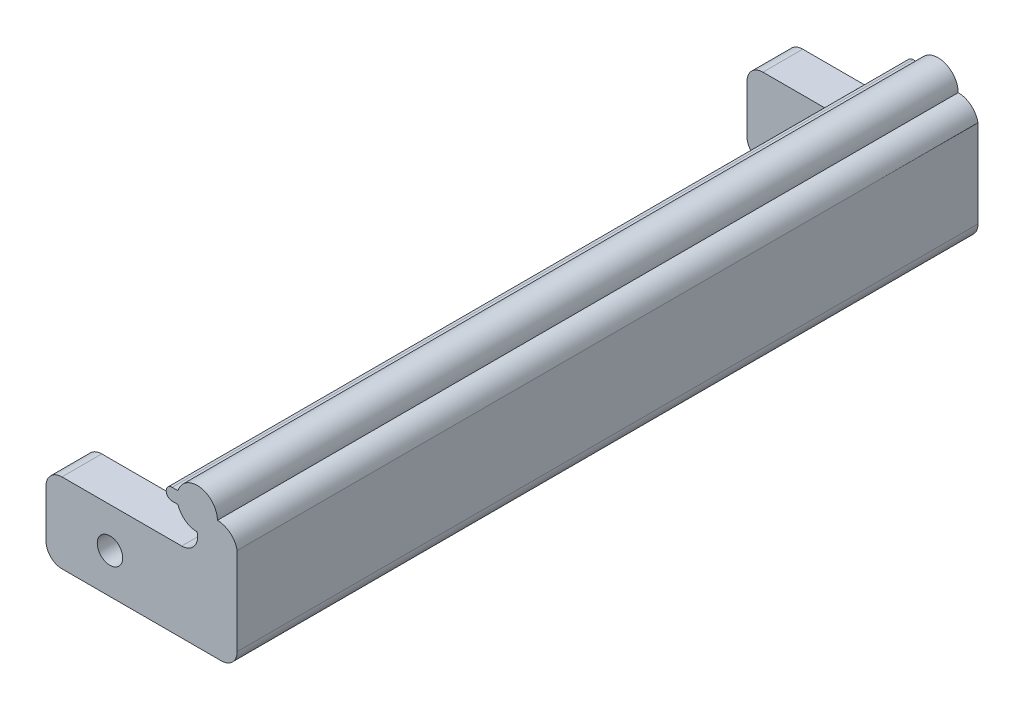
ISO-10303-21;
HEADER;
FILE_DESCRIPTION(('STEP AP214'),'2;1');
FILE_NAME('part.step','',(''),(''),'','','');
FILE_SCHEMA(('AUTOMOTIVE_DESIGN { 1 0 10303 214 1 1 1 1 }'));
ENDSEC;
DATA;
#1=APPLICATION_CONTEXT('core data for automotive mechanical design processes');
#2=APPLICATION_PROTOCOL_DEFINITION('international standard','automotive_design',2000,#1);
#3=PRODUCT_CONTEXT('',#1,'mechanical');
#4=PRODUCT('Part','Part','',(#3));
#5=PRODUCT_RELATED_PRODUCT_CATEGORY('part','',(#4));
#6=PRODUCT_DEFINITION_FORMATION('','',#4);
#7=PRODUCT_DEFINITION_CONTEXT('part definition',#1,'design');
#8=PRODUCT_DEFINITION('design','',#6,#7);
#9=PRODUCT_DEFINITION_SHAPE('','',#8);
#10=(LENGTH_UNIT() NAMED_UNIT(*) SI_UNIT(.MILLI.,.METRE.));
#11=(NAMED_UNIT(*) PLANE_ANGLE_UNIT() SI_UNIT($,.RADIAN.));
#12=(NAMED_UNIT(*) SI_UNIT($,.STERADIAN.) SOLID_ANGLE_UNIT());
#13=UNCERTAINTY_MEASURE_WITH_UNIT(LENGTH_MEASURE(1.E-05),#10,'distance_accuracy_value','');
#14=(GEOMETRIC_REPRESENTATION_CONTEXT(3) GLOBAL_UNCERTAINTY_ASSIGNED_CONTEXT((#13)) GLOBAL_UNIT_ASSIGNED_CONTEXT((#10,
#11,#12)) REPRESENTATION_CONTEXT('',''));
#15=CARTESIAN_POINT('',(0.,0.,0.));
#16=DIRECTION('',(0.,0.,1.));
#17=DIRECTION('',(1.,0.,0.));
#18=AXIS2_PLACEMENT_3D('',#15,#16,#17);
#19=CARTESIAN_POINT('',(21.5167448685236,12.5,93.));
#20=DIRECTION('',(0.,0.,-1.));
#21=DIRECTION('',(-1.,0.,0.));
#22=AXIS2_PLACEMENT_3D('',#19,#20,#21);
#23=CYLINDRICAL_SURFACE('',#22,2.53309219098003);
#24=CARTESIAN_POINT('',(21.5167448685236,12.5,93.));
#25=DIRECTION('',(0.,0.,1.));
#26=DIRECTION('',(1.,0.,0.));
#27=AXIS2_PLACEMENT_3D('',#24,#25,#26);
#28=CIRCLE('',#27,2.53309219098003);
#29=CARTESIAN_POINT('',(19.0334897370471,12.,93.));
#30=VERTEX_POINT('',#29);
#31=CARTESIAN_POINT('',(18.9836526775435,12.5,93.));
#32=VERTEX_POINT('',#31);
#33=EDGE_CURVE('E151',#30,#32,#28,.F.);
#34=ORIENTED_EDGE('',*,*,#33,.T.);
#35=DIRECTION('',(0.,0.,1.));
#36=VECTOR('',#35,1.);
#37=CARTESIAN_POINT('',(18.9836526775435,12.5,-8.18294731840835));
#38=LINE('',#37,#36);
#39=CARTESIAN_POINT('',(18.9836526775435,12.5,88.));
#40=VERTEX_POINT('',#39);
#41=EDGE_CURVE('E357',#40,#32,#38,.T.);
#42=ORIENTED_EDGE('',*,*,#41,.F.);
#43=CARTESIAN_POINT('',(21.5167448685236,12.5,88.));
#44=DIRECTION('',(0.,0.,1.));
#45=DIRECTION('',(1.,0.,0.));
#46=AXIS2_PLACEMENT_3D('',#43,#44,#45);
#47=CIRCLE('',#46,2.53309219098003);
#48=CARTESIAN_POINT('',(19.0334897370471,12.,88.));
#49=VERTEX_POINT('',#48);
#50=EDGE_CURVE('E209',#49,#40,#47,.F.);
#51=ORIENTED_EDGE('',*,*,#50,.F.);
#52=DIRECTION('',(0.,0.,-1.));
#53=VECTOR('',#52,1.);
#54=CARTESIAN_POINT('',(19.0334897370471,12.,93.));
#55=LINE('',#54,#53);
#56=EDGE_CURVE('E52',#30,#49,#55,.T.);
#57=ORIENTED_EDGE('',*,*,#56,.F.);
#58=EDGE_LOOP('',(#34,#42,#51,#57));
#59=FACE_BOUND('',#58,.T.);
#60=ADVANCED_FACE('F35',(#59),#23,.T.);
#61=CARTESIAN_POINT('',(21.5167448685236,12.5,5.00000000000002));
#62=DIRECTION('',(0.,0.,-1.));
#63=DIRECTION('',(-1.,0.,0.));
#64=AXIS2_PLACEMENT_3D('',#61,#62,#63);
#65=CIRCLE('',#64,2.53309219098003);
#66=CARTESIAN_POINT('',(18.9836526775435,12.5,5.));
#67=VERTEX_POINT('',#66);
#68=CARTESIAN_POINT('',(19.0334897370471,12.,5.00000000000002));
#69=VERTEX_POINT('',#68);
#70=EDGE_CURVE('E213',#67,#69,#65,.F.);
#71=ORIENTED_EDGE('',*,*,#70,.F.);
#72=CARTESIAN_POINT('',(18.9836526775435,12.5,0.));
#73=VERTEX_POINT('',#72);
#74=EDGE_CURVE('E347',#73,#67,#38,.T.);
#75=ORIENTED_EDGE('',*,*,#74,.F.);
#76=CARTESIAN_POINT('',(21.5167448685236,12.5,0.));
#77=DIRECTION('',(0.,0.,1.));
#78=DIRECTION('',(1.,0.,0.));
#79=AXIS2_PLACEMENT_3D('',#76,#77,#78);
#80=CIRCLE('',#79,2.53309219098003);
#81=CARTESIAN_POINT('',(19.0334897370471,12.,0.));
#82=VERTEX_POINT('',#81);
#83=EDGE_CURVE('E178',#82,#73,#80,.F.);
#84=ORIENTED_EDGE('',*,*,#83,.F.);
#85=EDGE_CURVE('E94',#69,#82,#55,.T.);
#86=ORIENTED_EDGE('',*,*,#85,.F.);
#87=EDGE_LOOP('',(#71,#75,#84,#86));
#88=FACE_BOUND('',#87,.T.);
#89=ADVANCED_FACE('F344',(#88),#23,.T.);
#90=CARTESIAN_POINT('',(21.5167448685236,15.03309219098,0.));
#91=VERTEX_POINT('',#90);
#92=CARTESIAN_POINT('',(24.,13.,0.));
#93=VERTEX_POINT('',#92);
#94=EDGE_CURVE('E86',#91,#93,#80,.F.);
#95=ORIENTED_EDGE('',*,*,#94,.F.);
#96=DIRECTION('',(0.,0.,1.));
#97=VECTOR('',#96,1.);
#98=CARTESIAN_POINT('',(21.5167448685236,15.03309219098,-8.18294731840835));
#99=LINE('',#98,#97);
#100=CARTESIAN_POINT('',(21.5167448685236,15.03309219098,93.));
#101=VERTEX_POINT('',#100);
#102=EDGE_CURVE('E354',#91,#101,#99,.T.);
#103=ORIENTED_EDGE('',*,*,#102,.T.);
#104=CARTESIAN_POINT('',(24.,13.,93.));
#105=VERTEX_POINT('',#104);
#106=EDGE_CURVE('E149',#101,#105,#28,.F.);
#107=ORIENTED_EDGE('',*,*,#106,.T.);
#108=DIRECTION('',(0.,0.,-1.));
#109=VECTOR('',#108,1.);
#110=CARTESIAN_POINT('',(24.,13.,93.));
#111=LINE('',#110,#109);
#112=EDGE_CURVE('E145',#105,#93,#111,.T.);
#113=ORIENTED_EDGE('',*,*,#112,.T.);
#114=EDGE_LOOP('',(#95,#103,#107,#113));
#115=FACE_BOUND('',#114,.T.);
#116=ADVANCED_FACE('F469',(#115),#23,.T.);
#117=CARTESIAN_POINT('',(17.0334897370471,12.,93.));
#118=DIRECTION('',(0.,0.,-1.));
#119=DIRECTION('',(-1.,0.,0.));
#120=AXIS2_PLACEMENT_3D('',#117,#118,#119);
#121=CYLINDRICAL_SURFACE('',#120,2.);
#122=CARTESIAN_POINT('',(17.0334897370471,12.,5.00000000000002));
#123=DIRECTION('',(0.,0.,-1.));
#124=DIRECTION('',(-1.,0.,0.));
#125=AXIS2_PLACEMENT_3D('',#122,#123,#124);
#126=CIRCLE('',#125,2.);
#127=CARTESIAN_POINT('',(17.0334897370471,10.,5.00000000000002));
#128=VERTEX_POINT('',#127);
#129=EDGE_CURVE('E278',#69,#128,#126,.T.);
#130=ORIENTED_EDGE('',*,*,#129,.F.);
#131=ORIENTED_EDGE('',*,*,#85,.T.);
#132=CARTESIAN_POINT('',(17.0334897370471,12.,0.));
#133=DIRECTION('',(0.,0.,1.));
#134=DIRECTION('',(1.,0.,0.));
#135=AXIS2_PLACEMENT_3D('',#132,#133,#134);
#136=CIRCLE('',#135,2.);
#137=CARTESIAN_POINT('',(17.0334897370471,10.,0.));
#138=VERTEX_POINT('',#137);
#139=EDGE_CURVE('E158',#138,#82,#136,.T.);
#140=ORIENTED_EDGE('',*,*,#139,.F.);
#141=DIRECTION('',(0.,0.,-1.));
#142=VECTOR('',#141,1.);
#143=CARTESIAN_POINT('',(17.0334897370471,10.,93.));
#144=LINE('',#143,#142);
#145=EDGE_CURVE('E204',#128,#138,#144,.T.);
#146=ORIENTED_EDGE('',*,*,#145,.F.);
#147=EDGE_LOOP('',(#130,#131,#140,#146));
#148=FACE_BOUND('',#147,.T.);
#149=ADVANCED_FACE('F337',(#148),#121,.F.);
#150=CARTESIAN_POINT('',(0.,10.,93.));
#151=DIRECTION('',(0.,1.,0.));
#152=DIRECTION('',(-1.,0.,0.));
#153=AXIS2_PLACEMENT_3D('',#150,#151,#152);
#154=PLANE('',#153);
#155=DIRECTION('',(-1.,0.,0.));
#156=VECTOR('',#155,1.);
#157=CARTESIAN_POINT('',(0.,10.,5.00000000000002));
#158=LINE('',#157,#156);
#159=CARTESIAN_POINT('',(2.00000000000001,10.,5.00000000000002));
#160=VERTEX_POINT('',#159);
#161=EDGE_CURVE('E281',#128,#160,#158,.T.);
#162=ORIENTED_EDGE('',*,*,#161,.F.);
#163=ORIENTED_EDGE('',*,*,#145,.T.);
#164=DIRECTION('',(1.,0.,0.));
#165=VECTOR('',#164,1.);
#166=CARTESIAN_POINT('',(0.,10.,0.));
#167=LINE('',#166,#165);
#168=CARTESIAN_POINT('',(2.00000000000001,10.,0.));
#169=VERTEX_POINT('',#168);
#170=EDGE_CURVE('E160',#169,#138,#167,.T.);
#171=ORIENTED_EDGE('',*,*,#170,.F.);
#172=DIRECTION('',(0.,0.,-1.));
#173=VECTOR('',#172,1.);
#174=CARTESIAN_POINT('',(2.00000000000001,10.,93.));
#175=LINE('',#174,#173);
#176=EDGE_CURVE('E200',#160,#169,#175,.T.);
#177=ORIENTED_EDGE('',*,*,#176,.F.);
#178=EDGE_LOOP('',(#162,#163,#171,#177));
#179=FACE_BOUND('',#178,.T.);
#180=ADVANCED_FACE('F333',(#179),#154,.T.);
#181=CARTESIAN_POINT('',(2.,8.00000000000002,93.));
#182=DIRECTION('',(0.,0.,-1.));
#183=DIRECTION('',(-1.,0.,0.));
#184=AXIS2_PLACEMENT_3D('',#181,#182,#183);
#185=CYLINDRICAL_SURFACE('',#184,2.);
#186=DIRECTION('',(0.,0.,-1.));
#187=VECTOR('',#186,1.);
#188=CARTESIAN_POINT('',(0.,8.,93.));
#189=LINE('',#188,#187);
#190=CARTESIAN_POINT('',(-5.24878825814223E-13,7.99999999999998,5.));
#191=VERTEX_POINT('',#190);
#192=CARTESIAN_POINT('',(0.,8.,0.));
#193=VERTEX_POINT('',#192);
#194=EDGE_CURVE('E196',#191,#193,#189,.T.);
#195=ORIENTED_EDGE('',*,*,#194,.F.);
#196=CARTESIAN_POINT('',(2.,8.00000000000002,5.00000000000002));
#197=DIRECTION('',(0.,0.,-1.));
#198=DIRECTION('',(-1.,0.,0.));
#199=AXIS2_PLACEMENT_3D('',#196,#197,#198);
#200=CIRCLE('',#199,2.);
#201=EDGE_CURVE('E284',#191,#160,#200,.T.);
#202=ORIENTED_EDGE('',*,*,#201,.T.);
#203=ORIENTED_EDGE('',*,*,#176,.T.);
#204=CARTESIAN_POINT('',(2.,8.00000000000002,0.));
#205=DIRECTION('',(0.,0.,1.));
#206=DIRECTION('',(1.,0.,0.));
#207=AXIS2_PLACEMENT_3D('',#204,#205,#206);
#208=CIRCLE('',#207,2.);
#209=EDGE_CURVE('E164',#169,#193,#208,.T.);
#210=ORIENTED_EDGE('',*,*,#209,.T.);
#211=EDGE_LOOP('',(#195,#202,#203,#210));
#212=FACE_BOUND('',#211,.T.);
#213=ADVANCED_FACE('F328',(#212),#185,.T.);
#214=CARTESIAN_POINT('',(0.,0.,93.));
#215=DIRECTION('',(1.,0.,0.));
#216=DIRECTION('',(0.,1.,0.));
#217=AXIS2_PLACEMENT_3D('',#214,#215,#216);
#218=PLANE('',#217);
#219=DIRECTION('',(0.,0.,-1.));
#220=VECTOR('',#219,1.);
#221=CARTESIAN_POINT('',(0.,2.00000000000001,93.));
#222=LINE('',#221,#220);
#223=CARTESIAN_POINT('',(-5.26054894089967E-13,2.,5.00000000000002));
#224=VERTEX_POINT('',#223);
#225=CARTESIAN_POINT('',(0.,2.00000000000001,0.));
#226=VERTEX_POINT('',#225);
#227=EDGE_CURVE('E192',#224,#226,#222,.T.);
#228=ORIENTED_EDGE('',*,*,#227,.F.);
#229=DIRECTION('',(0.,1.,0.));
#230=VECTOR('',#229,1.);
#231=CARTESIAN_POINT('',(-5.53675235515438E-13,-75.,5.));
#232=LINE('',#231,#230);
#233=EDGE_CURVE('E210',#224,#191,#232,.T.);
#234=ORIENTED_EDGE('',*,*,#233,.T.);
#235=ORIENTED_EDGE('',*,*,#194,.T.);
#236=DIRECTION('',(0.,-1.,0.));
#237=VECTOR('',#236,1.);
#238=CARTESIAN_POINT('',(0.,0.,0.));
#239=LINE('',#238,#237);
#240=EDGE_CURVE('E167',#193,#226,#239,.T.);
#241=ORIENTED_EDGE('',*,*,#240,.T.);
#242=EDGE_LOOP('',(#228,#234,#235,#241));
#243=FACE_BOUND('',#242,.T.);
#244=ADVANCED_FACE('F323',(#243),#218,.F.);
#245=CARTESIAN_POINT('',(2.,2.,93.));
#246=DIRECTION('',(0.,0.,-1.));
#247=DIRECTION('',(-1.,0.,0.));
#248=AXIS2_PLACEMENT_3D('',#245,#246,#247);
#249=CYLINDRICAL_SURFACE('',#248,2.);
#250=DIRECTION('',(0.,0.,-1.));
#251=VECTOR('',#250,1.);
#252=CARTESIAN_POINT('',(2.00000000000001,0.,93.));
#253=LINE('',#252,#251);
#254=CARTESIAN_POINT('',(2.00000000000001,0.,5.00000000000002));
#255=VERTEX_POINT('',#254);
#256=CARTESIAN_POINT('',(2.00000000000001,0.,0.));
#257=VERTEX_POINT('',#256);
#258=EDGE_CURVE('E188',#255,#257,#253,.T.);
#259=ORIENTED_EDGE('',*,*,#258,.F.);
#260=CARTESIAN_POINT('',(2.,2.,5.00000000000002));
#261=DIRECTION('',(0.,0.,-1.));
#262=DIRECTION('',(-1.,0.,0.));
#263=AXIS2_PLACEMENT_3D('',#260,#261,#262);
#264=CIRCLE('',#263,2.);
#265=EDGE_CURVE('E161',#255,#224,#264,.T.);
#266=ORIENTED_EDGE('',*,*,#265,.T.);
#267=ORIENTED_EDGE('',*,*,#227,.T.);
#268=CARTESIAN_POINT('',(2.,2.,0.));
#269=DIRECTION('',(0.,0.,1.));
#270=DIRECTION('',(1.,0.,0.));
#271=AXIS2_PLACEMENT_3D('',#268,#269,#270);
#272=CIRCLE('',#271,2.);
#273=EDGE_CURVE('E170',#226,#257,#272,.T.);
#274=ORIENTED_EDGE('',*,*,#273,.T.);
#275=EDGE_LOOP('',(#259,#266,#267,#274));
#276=FACE_BOUND('',#275,.T.);
#277=ADVANCED_FACE('F318',(#276),#249,.T.);
#278=CARTESIAN_POINT('',(8.03128057732869,5.00000000000001,93.));
#279=DIRECTION('',(0.,0.,-1.));
#280=DIRECTION('',(-1.,0.,0.));
#281=AXIS2_PLACEMENT_3D('',#278,#279,#280);
#282=CYLINDRICAL_SURFACE('',#281,1.6);
#283=CARTESIAN_POINT('',(8.03128057732869,5.00000000000001,5.00000000000002));
#284=DIRECTION('',(0.,0.,-1.));
#285=DIRECTION('',(-1.,0.,0.));
#286=AXIS2_PLACEMENT_3D('',#283,#284,#285);
#287=CIRCLE('',#286,1.6);
#288=CARTESIAN_POINT('',(6.43128057732869,5.00000000000001,5.00000000000002));
#289=VERTEX_POINT('',#288);
#290=EDGE_CURVE('E211',#289,#289,#287,.T.);
#291=CARTESIAN_POINT('',(8.03128057732869,5.00000000000001,0.));
#292=DIRECTION('',(0.,0.,1.));
#293=DIRECTION('',(1.,0.,0.));
#294=AXIS2_PLACEMENT_3D('',#291,#292,#293);
#295=CIRCLE('',#294,1.6);
#296=CARTESIAN_POINT('',(6.43128057732869,5.00000000000001,0.));
#297=VERTEX_POINT('',#296);
#298=EDGE_CURVE('E181',#297,#297,#295,.T.);
#299=CARTESIAN_POINT('',(6.43128057732869,5.00000000000001,5.00000000000002));
#300=CARTESIAN_POINT('',(6.43128057732869,5.00000000000001,4.94791666666669));
#301=CARTESIAN_POINT('',(6.43128057732869,5.00000000000001,4.89583333333335));
#302=CARTESIAN_POINT('',(6.43128057732869,5.00000000000001,4.79166666666668));
#303=CARTESIAN_POINT('',(6.43128057732869,5.00000000000001,4.73958333333335));
#304=CARTESIAN_POINT('',(6.43128057732869,5.00000000000001,4.63541666666668));
#305=CARTESIAN_POINT('',(6.43128057732869,5.00000000000001,4.58333333333335));
#306=CARTESIAN_POINT('',(6.43128057732869,5.00000000000001,4.47916666666668));
#307=CARTESIAN_POINT('',(6.43128057732869,5.00000000000001,4.42708333333335));
#308=CARTESIAN_POINT('',(6.43128057732869,5.00000000000001,4.32291666666668));
#309=CARTESIAN_POINT('',(6.43128057732869,5.00000000000001,4.27083333333334));
#310=CARTESIAN_POINT('',(6.43128057732869,5.00000000000001,4.16666666666667));
#311=CARTESIAN_POINT('',(6.43128057732869,5.00000000000001,4.11458333333334));
#312=CARTESIAN_POINT('',(6.43128057732869,5.00000000000001,4.01041666666668));
#313=CARTESIAN_POINT('',(6.43128057732869,5.00000000000001,3.95833333333335));
#314=CARTESIAN_POINT('',(6.43128057732869,5.00000000000001,3.85416666666668));
#315=CARTESIAN_POINT('',(6.43128057732869,5.00000000000001,3.80208333333335));
#316=CARTESIAN_POINT('',(6.43128057732869,5.00000000000001,3.69791666666668));
#317=CARTESIAN_POINT('',(6.43128057732869,5.00000000000001,3.64583333333334));
#318=CARTESIAN_POINT('',(6.43128057732869,5.00000000000001,3.54166666666667));
#319=CARTESIAN_POINT('',(6.43128057732869,5.00000000000001,3.48958333333334));
#320=CARTESIAN_POINT('',(6.43128057732869,5.00000000000001,3.38541666666668));
#321=CARTESIAN_POINT('',(6.43128057732869,5.00000000000001,3.33333333333335));
#322=CARTESIAN_POINT('',(6.43128057732869,5.00000000000001,3.22916666666668));
#323=CARTESIAN_POINT('',(6.43128057732869,5.00000000000001,3.17708333333334));
#324=CARTESIAN_POINT('',(6.43128057732869,5.00000000000001,3.07291666666667));
#325=CARTESIAN_POINT('',(6.43128057732869,5.00000000000001,3.02083333333334));
#326=CARTESIAN_POINT('',(6.43128057732869,5.00000000000001,2.91666666666667));
#327=CARTESIAN_POINT('',(6.43128057732869,5.00000000000001,2.86458333333334));
#328=CARTESIAN_POINT('',(6.43128057732869,5.00000000000001,2.76041666666667));
#329=CARTESIAN_POINT('',(6.43128057732869,5.00000000000001,2.70833333333334));
#330=CARTESIAN_POINT('',(6.43128057732869,5.00000000000001,2.60416666666667));
#331=CARTESIAN_POINT('',(6.43128057732869,5.00000000000001,2.55208333333333));
#332=CARTESIAN_POINT('',(6.43128057732869,5.00000000000001,2.44791666666667));
#333=CARTESIAN_POINT('',(6.43128057732869,5.00000000000001,2.39583333333334));
#334=CARTESIAN_POINT('',(6.43128057732869,5.00000000000001,2.29166666666667));
#335=CARTESIAN_POINT('',(6.43128057732869,5.00000000000001,2.23958333333333));
#336=CARTESIAN_POINT('',(6.43128057732869,5.00000000000001,2.13541666666666));
#337=CARTESIAN_POINT('',(6.43128057732869,5.00000000000001,2.08333333333333));
#338=CARTESIAN_POINT('',(6.43128057732869,5.00000000000001,1.97916666666667));
#339=CARTESIAN_POINT('',(6.43128057732869,5.00000000000001,1.92708333333333));
#340=CARTESIAN_POINT('',(6.43128057732869,5.00000000000001,1.82291666666666));
#341=CARTESIAN_POINT('',(6.43128057732869,5.00000000000001,1.77083333333333));
#342=CARTESIAN_POINT('',(6.43128057732869,5.00000000000001,1.66666666666666));
#343=CARTESIAN_POINT('',(6.43128057732869,5.00000000000001,1.61458333333333));
#344=CARTESIAN_POINT('',(6.43128057732869,5.00000000000001,1.51041666666666));
#345=CARTESIAN_POINT('',(6.43128057732869,5.00000000000001,1.45833333333333));
#346=CARTESIAN_POINT('',(6.43128057732869,5.00000000000001,1.35416666666666));
#347=CARTESIAN_POINT('',(6.43128057732869,5.00000000000001,1.30208333333332));
#348=CARTESIAN_POINT('',(6.43128057732869,5.00000000000001,1.19791666666665));
#349=CARTESIAN_POINT('',(6.43128057732869,5.00000000000001,1.14583333333332));
#350=CARTESIAN_POINT('',(6.43128057732869,5.00000000000001,1.04166666666666));
#351=CARTESIAN_POINT('',(6.43128057732869,5.00000000000001,0.989583333333326));
#352=CARTESIAN_POINT('',(6.43128057732869,5.00000000000001,0.885416666666662));
#353=CARTESIAN_POINT('',(6.43128057732869,5.00000000000001,0.833333333333329));
#354=CARTESIAN_POINT('',(6.43128057732869,5.00000000000001,0.72916666666666));
#355=CARTESIAN_POINT('',(6.43128057732869,5.00000000000001,0.677083333333323));
#356=CARTESIAN_POINT('',(6.43128057732869,5.00000000000001,0.572916666666654));
#357=CARTESIAN_POINT('',(6.43128057732869,5.00000000000001,0.520833333333322));
#358=CARTESIAN_POINT('',(6.43128057732869,5.00000000000001,0.416666666666658));
#359=CARTESIAN_POINT('',(6.43128057732869,5.00000000000001,0.364583333333326));
#360=CARTESIAN_POINT('',(6.43128057732869,5.00000000000001,0.260416666666656));
#361=CARTESIAN_POINT('',(6.43128057732869,5.00000000000001,0.20833333333332));
#362=CARTESIAN_POINT('',(6.43128057732869,5.00000000000001,0.104166666666651));
#363=CARTESIAN_POINT('',(6.43128057732869,5.00000000000001,0.0520833333333184));
#364=CARTESIAN_POINT('',(6.43128057732869,5.00000000000001,0.));
#365=B_SPLINE_CURVE_WITH_KNOTS('',3,(#299,#300,#301,#302,#303,#304,#305,#306,#307,#308,#309,
#310,#311,#312,#313,#314,#315,#316,#317,#318,#319,#320,#321,#322,#323,#324,#325,#326,#327,#328,
#329,#330,#331,#332,#333,#334,#335,#336,#337,#338,#339,#340,#341,#342,#343,#344,#345,#346,#347,
#348,#349,#350,#351,#352,#353,#354,#355,#356,#357,#358,#359,#360,#361,#362,#363,#364),
.UNSPECIFIED.,.F.,.F.,(4,2,2,2,2,2,2,2,2,2,2,2,2,2,2,2,2,2,2,2,2,2,2,2,2,2,2,2,2,2,2,2,4),(0.,
0.156249999999997,0.312500000000007,0.468750000000004,0.625000000000001,0.781250000000011,
0.937500000000008,1.09375,1.25,1.40625000000001,1.56250000000001,1.71875,1.87500000000002,
2.03125000000001,2.18750000000001,2.34375000000002,2.50000000000002,2.65625000000001,
2.81250000000002,2.96875000000002,3.12500000000002,3.28125000000003,3.43750000000002,
3.59375000000002,3.75000000000003,3.90625000000003,4.06250000000002,4.21875000000002,
4.37500000000003,4.53125000000003,4.68750000000002,4.84375000000004,5.00000000000003),.UNSPECIFIED.);
#366=EDGE_CURVE('BSEAM600',#289,#297,#365,.T.);
#367=ORIENTED_EDGE('',*,*,#290,.F.);
#368=ORIENTED_EDGE('',*,*,#298,.F.);
#369=ORIENTED_EDGE('',*,*,#366,.T.);
#370=ORIENTED_EDGE('',*,*,#366,.F.);
#371=EDGE_LOOP('',(#367,#369,#368,#370));
#372=FACE_BOUND('',#371,.T.);
#373=ADVANCED_FACE('F600',(#372),#282,.F.);
#374=CARTESIAN_POINT('',(17.0334897370471,12.,88.));
#375=DIRECTION('',(0.,0.,1.));
#376=DIRECTION('',(1.,0.,0.));
#377=AXIS2_PLACEMENT_3D('',#374,#375,#376);
#378=CIRCLE('',#377,2.);
#379=CARTESIAN_POINT('',(17.0334897370471,10.,88.));
#380=VERTEX_POINT('',#379);
#381=EDGE_CURVE('E263',#380,#49,#378,.T.);
#382=ORIENTED_EDGE('',*,*,#381,.F.);
#383=CARTESIAN_POINT('',(17.0334897370471,10.,93.));
#384=VERTEX_POINT('',#383);
#385=EDGE_CURVE('E102',#384,#380,#144,.T.);
#386=ORIENTED_EDGE('',*,*,#385,.F.);
#387=CARTESIAN_POINT('',(17.0334897370471,12.,93.));
#388=DIRECTION('',(0.,0.,1.));
#389=DIRECTION('',(1.,0.,0.));
#390=AXIS2_PLACEMENT_3D('',#387,#388,#389);
#391=CIRCLE('',#390,2.);
#392=EDGE_CURVE('E184',#384,#30,#391,.T.);
#393=ORIENTED_EDGE('',*,*,#392,.T.);
#394=ORIENTED_EDGE('',*,*,#56,.T.);
#395=EDGE_LOOP('',(#382,#386,#393,#394));
#396=FACE_BOUND('',#395,.T.);
#397=ADVANCED_FACE('F37',(#396),#121,.F.);
#398=DIRECTION('',(1.,0.,0.));
#399=VECTOR('',#398,1.);
#400=CARTESIAN_POINT('',(0.,10.,88.));
#401=LINE('',#400,#399);
#402=CARTESIAN_POINT('',(2.00000000000001,10.,88.));
#403=VERTEX_POINT('',#402);
#404=EDGE_CURVE('E266',#403,#380,#401,.T.);
#405=ORIENTED_EDGE('',*,*,#404,.F.);
#406=CARTESIAN_POINT('',(2.00000000000001,10.,93.));
#407=VERTEX_POINT('',#406);
#408=EDGE_CURVE('E201',#407,#403,#175,.T.);
#409=ORIENTED_EDGE('',*,*,#408,.F.);
#410=DIRECTION('',(1.,0.,0.));
#411=VECTOR('',#410,1.);
#412=CARTESIAN_POINT('',(0.,10.,93.));
#413=LINE('',#412,#411);
#414=EDGE_CURVE('E293',#407,#384,#413,.T.);
#415=ORIENTED_EDGE('',*,*,#414,.T.);
#416=ORIENTED_EDGE('',*,*,#385,.T.);
#417=EDGE_LOOP('',(#405,#409,#415,#416));
#418=FACE_BOUND('',#417,.T.);
#419=ADVANCED_FACE('F426',(#418),#154,.T.);
#420=ORIENTED_EDGE('',*,*,#408,.T.);
#421=CARTESIAN_POINT('',(2.,8.00000000000002,88.));
#422=DIRECTION('',(0.,0.,1.));
#423=DIRECTION('',(1.,0.,0.));
#424=AXIS2_PLACEMENT_3D('',#421,#422,#423);
#425=CIRCLE('',#424,2.);
#426=CARTESIAN_POINT('',(-5.147142573813E-13,7.99999999999998,88.));
#427=VERTEX_POINT('',#426);
#428=EDGE_CURVE('E269',#403,#427,#425,.T.);
#429=ORIENTED_EDGE('',*,*,#428,.T.);
#430=CARTESIAN_POINT('',(0.,8.,93.));
#431=VERTEX_POINT('',#430);
#432=EDGE_CURVE('E197',#431,#427,#189,.T.);
#433=ORIENTED_EDGE('',*,*,#432,.F.);
#434=CARTESIAN_POINT('',(2.,8.00000000000002,93.));
#435=DIRECTION('',(0.,0.,1.));
#436=DIRECTION('',(1.,0.,0.));
#437=AXIS2_PLACEMENT_3D('',#434,#435,#436);
#438=CIRCLE('',#437,2.);
#439=EDGE_CURVE('E296',#407,#431,#438,.T.);
#440=ORIENTED_EDGE('',*,*,#439,.F.);
#441=EDGE_LOOP('',(#420,#429,#433,#440));
#442=FACE_BOUND('',#441,.T.);
#443=ADVANCED_FACE('F422',(#442),#185,.T.);
#444=ORIENTED_EDGE('',*,*,#432,.T.);
#445=DIRECTION('',(0.,1.,0.));
#446=VECTOR('',#445,1.);
#447=CARTESIAN_POINT('',(-5.43510667082515E-13,-75.,88.));
#448=LINE('',#447,#446);
#449=CARTESIAN_POINT('',(-5.15646553234106E-13,2.,88.));
#450=VERTEX_POINT('',#449);
#451=EDGE_CURVE('E247',#450,#427,#448,.T.);
#452=ORIENTED_EDGE('',*,*,#451,.F.);
#453=CARTESIAN_POINT('',(0.,2.00000000000001,93.));
#454=VERTEX_POINT('',#453);
#455=EDGE_CURVE('E193',#454,#450,#222,.T.);
#456=ORIENTED_EDGE('',*,*,#455,.F.);
#457=DIRECTION('',(0.,-1.,0.));
#458=VECTOR('',#457,1.);
#459=CARTESIAN_POINT('',(0.,0.,93.));
#460=LINE('',#459,#458);
#461=EDGE_CURVE('E298',#431,#454,#460,.T.);
#462=ORIENTED_EDGE('',*,*,#461,.F.);
#463=EDGE_LOOP('',(#444,#452,#456,#462));
#464=FACE_BOUND('',#463,.T.);
#465=ADVANCED_FACE('F418',(#464),#218,.F.);
#466=ORIENTED_EDGE('',*,*,#455,.T.);
#467=CARTESIAN_POINT('',(2.,2.,88.));
#468=DIRECTION('',(0.,0.,1.));
#469=DIRECTION('',(1.,0.,0.));
#470=AXIS2_PLACEMENT_3D('',#467,#468,#469);
#471=CIRCLE('',#470,2.);
#472=CARTESIAN_POINT('',(2.00000000000001,0.,88.));
#473=VERTEX_POINT('',#472);
#474=EDGE_CURVE('E214',#450,#473,#471,.T.);
#475=ORIENTED_EDGE('',*,*,#474,.T.);
#476=CARTESIAN_POINT('',(2.00000000000001,0.,93.));
#477=VERTEX_POINT('',#476);
#478=EDGE_CURVE('E189',#477,#473,#253,.T.);
#479=ORIENTED_EDGE('',*,*,#478,.F.);
#480=CARTESIAN_POINT('',(2.,2.,93.));
#481=DIRECTION('',(0.,0.,1.));
#482=DIRECTION('',(1.,0.,0.));
#483=AXIS2_PLACEMENT_3D('',#480,#481,#482);
#484=CIRCLE('',#483,2.);
#485=EDGE_CURVE('E300',#454,#477,#484,.T.);
#486=ORIENTED_EDGE('',*,*,#485,.F.);
#487=EDGE_LOOP('',(#466,#475,#479,#486));
#488=FACE_BOUND('',#487,.T.);
#489=ADVANCED_FACE('F306',(#488),#249,.T.);
#490=CARTESIAN_POINT('',(0.,0.,93.));
#491=DIRECTION('',(0.,1.,0.));
#492=DIRECTION('',(0.,0.,1.));
#493=AXIS2_PLACEMENT_3D('',#490,#491,#492);
#494=PLANE('',#493);
#495=DIRECTION('',(0.,0.,-1.));
#496=VECTOR('',#495,1.);
#497=CARTESIAN_POINT('',(21.2677879719184,0.,93.));
#498=LINE('',#497,#496);
#499=CARTESIAN_POINT('',(21.2677879719184,0.,88.));
#500=VERTEX_POINT('',#499);
#501=CARTESIAN_POINT('',(21.2677879719184,0.,5.));
#502=VERTEX_POINT('',#501);
#503=EDGE_CURVE('E11',#500,#502,#498,.T.);
#504=ORIENTED_EDGE('',*,*,#503,.T.);
#505=DIRECTION('',(-1.,0.,0.));
#506=VECTOR('',#505,1.);
#507=CARTESIAN_POINT('',(0.,0.,5.00000000000002));
#508=LINE('',#507,#506);
#509=EDGE_CURVE('E287',#502,#255,#508,.T.);
#510=ORIENTED_EDGE('',*,*,#509,.T.);
#511=ORIENTED_EDGE('',*,*,#258,.T.);
#512=DIRECTION('',(1.,0.,0.));
#513=VECTOR('',#512,1.);
#514=CARTESIAN_POINT('',(0.,0.,0.));
#515=LINE('',#514,#513);
#516=CARTESIAN_POINT('',(22.,0.,0.));
#517=VERTEX_POINT('',#516);
#518=EDGE_CURVE('E173',#257,#517,#515,.T.);
#519=ORIENTED_EDGE('',*,*,#518,.T.);
#520=DIRECTION('',(0.,0.,-1.));
#521=VECTOR('',#520,1.);
#522=CARTESIAN_POINT('',(22.,0.,93.));
#523=LINE('',#522,#521);
#524=CARTESIAN_POINT('',(22.,0.,93.));
#525=VERTEX_POINT('',#524);
#526=EDGE_CURVE('E144',#525,#517,#523,.T.);
#527=ORIENTED_EDGE('',*,*,#526,.F.);
#528=DIRECTION('',(1.,0.,0.));
#529=VECTOR('',#528,1.);
#530=CARTESIAN_POINT('',(0.,0.,93.));
#531=LINE('',#530,#529);
#532=EDGE_CURVE('E132',#477,#525,#531,.T.);
#533=ORIENTED_EDGE('',*,*,#532,.F.);
#534=ORIENTED_EDGE('',*,*,#478,.T.);
#535=DIRECTION('',(1.,0.,0.));
#536=VECTOR('',#535,1.);
#537=CARTESIAN_POINT('',(0.,0.,88.));
#538=LINE('',#537,#536);
#539=EDGE_CURVE('E272',#473,#500,#538,.T.);
#540=ORIENTED_EDGE('',*,*,#539,.T.);
#541=EDGE_LOOP('',(#504,#510,#511,#519,#527,#533,#534,#540));
#542=FACE_BOUND('',#541,.T.);
#543=ADVANCED_FACE('F309',(#542),#494,.F.);
#544=CARTESIAN_POINT('',(22.,2.,93.));
#545=DIRECTION('',(0.,0.,-1.));
#546=DIRECTION('',(-1.,0.,0.));
#547=AXIS2_PLACEMENT_3D('',#544,#545,#546);
#548=CYLINDRICAL_SURFACE('',#547,2.);
#549=CARTESIAN_POINT('',(22.,2.,0.));
#550=DIRECTION('',(0.,0.,1.));
#551=DIRECTION('',(1.,0.,0.));
#552=AXIS2_PLACEMENT_3D('',#549,#550,#551);
#553=CIRCLE('',#552,2.);
#554=CARTESIAN_POINT('',(24.,2.,0.));
#555=VERTEX_POINT('',#554);
#556=EDGE_CURVE('E141',#517,#555,#553,.T.);
#557=ORIENTED_EDGE('',*,*,#556,.T.);
#558=DIRECTION('',(0.,0.,-1.));
#559=VECTOR('',#558,1.);
#560=CARTESIAN_POINT('',(24.,2.,93.));
#561=LINE('',#560,#559);
#562=CARTESIAN_POINT('',(24.,2.,93.));
#563=VERTEX_POINT('',#562);
#564=EDGE_CURVE('E138',#563,#555,#561,.T.);
#565=ORIENTED_EDGE('',*,*,#564,.F.);
#566=CARTESIAN_POINT('',(22.,2.,93.));
#567=DIRECTION('',(0.,0.,1.));
#568=DIRECTION('',(1.,0.,0.));
#569=AXIS2_PLACEMENT_3D('',#566,#567,#568);
#570=CIRCLE('',#569,2.);
#571=EDGE_CURVE('E124',#525,#563,#570,.T.);
#572=ORIENTED_EDGE('',*,*,#571,.F.);
#573=ORIENTED_EDGE('',*,*,#526,.T.);
#574=EDGE_LOOP('',(#557,#565,#572,#573));
#575=FACE_BOUND('',#574,.T.);
#576=ADVANCED_FACE('F139',(#575),#548,.T.);
#577=CARTESIAN_POINT('',(24.,0.,93.));
#578=DIRECTION('',(1.,0.,0.));
#579=DIRECTION('',(0.,1.,0.));
#580=AXIS2_PLACEMENT_3D('',#577,#578,#579);
#581=PLANE('',#580);
#582=DIRECTION('',(0.,-1.,0.));
#583=VECTOR('',#582,1.);
#584=CARTESIAN_POINT('',(24.,0.,0.));
#585=LINE('',#584,#583);
#586=EDGE_CURVE('E176',#93,#555,#585,.T.);
#587=ORIENTED_EDGE('',*,*,#586,.F.);
#588=ORIENTED_EDGE('',*,*,#112,.F.);
#589=DIRECTION('',(0.,-1.,0.));
#590=VECTOR('',#589,1.);
#591=CARTESIAN_POINT('',(24.,0.,93.));
#592=LINE('',#591,#590);
#593=EDGE_CURVE('E130',#105,#563,#592,.T.);
#594=ORIENTED_EDGE('',*,*,#593,.T.);
#595=ORIENTED_EDGE('',*,*,#564,.T.);
#596=EDGE_LOOP('',(#587,#588,#594,#595));
#597=FACE_BOUND('',#596,.T.);
#598=ADVANCED_FACE('F148',(#597),#581,.T.);
#599=CARTESIAN_POINT('',(8.03128057732869,5.00000000000001,88.));
#600=DIRECTION('',(0.,0.,1.));
#601=DIRECTION('',(1.,0.,0.));
#602=AXIS2_PLACEMENT_3D('',#599,#600,#601);
#603=CIRCLE('',#602,1.6);
#604=CARTESIAN_POINT('',(6.43128057732869,5.00000000000001,88.));
#605=VERTEX_POINT('',#604);
#606=EDGE_CURVE('E206',#605,#605,#603,.T.);
#607=CARTESIAN_POINT('',(8.03128057732869,5.00000000000001,93.));
#608=DIRECTION('',(0.,0.,1.));
#609=DIRECTION('',(1.,0.,0.));
#610=AXIS2_PLACEMENT_3D('',#607,#608,#609);
#611=CIRCLE('',#610,1.6);
#612=CARTESIAN_POINT('',(6.43128057732869,5.00000000000001,93.));
#613=VERTEX_POINT('',#612);
#614=EDGE_CURVE('E155',#613,#613,#611,.T.);
#615=CARTESIAN_POINT('',(6.43128057732869,5.00000000000001,88.));
#616=CARTESIAN_POINT('',(6.43128057732869,5.00000000000001,88.0520833333333));
#617=CARTESIAN_POINT('',(6.43128057732869,5.00000000000001,88.1041666666667));
#618=CARTESIAN_POINT('',(6.43128057732869,5.00000000000001,88.2083333333333));
#619=CARTESIAN_POINT('',(6.43128057732869,5.00000000000001,88.2604166666667));
#620=CARTESIAN_POINT('',(6.43128057732869,5.00000000000001,88.3645833333333));
#621=CARTESIAN_POINT('',(6.43128057732869,5.00000000000001,88.4166666666667));
#622=CARTESIAN_POINT('',(6.43128057732869,5.00000000000001,88.5208333333333));
#623=CARTESIAN_POINT('',(6.43128057732869,5.00000000000001,88.5729166666667));
#624=CARTESIAN_POINT('',(6.43128057732869,5.00000000000001,88.6770833333333));
#625=CARTESIAN_POINT('',(6.43128057732869,5.00000000000001,88.7291666666667));
#626=CARTESIAN_POINT('',(6.43128057732869,5.00000000000001,88.8333333333333));
#627=CARTESIAN_POINT('',(6.43128057732869,5.00000000000001,88.8854166666667));
#628=CARTESIAN_POINT('',(6.43128057732869,5.00000000000001,88.9895833333333));
#629=CARTESIAN_POINT('',(6.43128057732869,5.00000000000001,89.0416666666667));
#630=CARTESIAN_POINT('',(6.43128057732869,5.00000000000001,89.1458333333333));
#631=CARTESIAN_POINT('',(6.43128057732869,5.00000000000001,89.1979166666667));
#632=CARTESIAN_POINT('',(6.43128057732869,5.00000000000001,89.3020833333333));
#633=CARTESIAN_POINT('',(6.43128057732869,5.00000000000001,89.3541666666667));
#634=CARTESIAN_POINT('',(6.43128057732869,5.00000000000001,89.4583333333333));
#635=CARTESIAN_POINT('',(6.43128057732869,5.00000000000001,89.5104166666667));
#636=CARTESIAN_POINT('',(6.43128057732869,5.00000000000001,89.6145833333333));
#637=CARTESIAN_POINT('',(6.43128057732869,5.00000000000001,89.6666666666667));
#638=CARTESIAN_POINT('',(6.43128057732869,5.00000000000001,89.7708333333333));
#639=CARTESIAN_POINT('',(6.43128057732869,5.00000000000001,89.8229166666667));
#640=CARTESIAN_POINT('',(6.43128057732869,5.00000000000001,89.9270833333333));
#641=CARTESIAN_POINT('',(6.43128057732869,5.00000000000001,89.9791666666667));
#642=CARTESIAN_POINT('',(6.43128057732869,5.00000000000001,90.0833333333333));
#643=CARTESIAN_POINT('',(6.43128057732869,5.00000000000001,90.1354166666667));
#644=CARTESIAN_POINT('',(6.43128057732869,5.00000000000001,90.2395833333333));
#645=CARTESIAN_POINT('',(6.43128057732869,5.00000000000001,90.2916666666667));
#646=CARTESIAN_POINT('',(6.43128057732869,5.00000000000001,90.3958333333333));
#647=CARTESIAN_POINT('',(6.43128057732869,5.00000000000001,90.4479166666667));
#648=CARTESIAN_POINT('',(6.43128057732869,5.00000000000001,90.5520833333333));
#649=CARTESIAN_POINT('',(6.43128057732869,5.00000000000001,90.6041666666667));
#650=CARTESIAN_POINT('',(6.43128057732869,5.00000000000001,90.7083333333333));
#651=CARTESIAN_POINT('',(6.43128057732869,5.00000000000001,90.7604166666667));
#652=CARTESIAN_POINT('',(6.43128057732869,5.00000000000001,90.8645833333333));
#653=CARTESIAN_POINT('',(6.43128057732869,5.00000000000001,90.9166666666667));
#654=CARTESIAN_POINT('',(6.43128057732869,5.00000000000001,91.0208333333333));
#655=CARTESIAN_POINT('',(6.43128057732869,5.00000000000001,91.0729166666667));
#656=CARTESIAN_POINT('',(6.43128057732869,5.00000000000001,91.1770833333333));
#657=CARTESIAN_POINT('',(6.43128057732869,5.00000000000001,91.2291666666667));
#658=CARTESIAN_POINT('',(6.43128057732869,5.00000000000001,91.3333333333333));
#659=CARTESIAN_POINT('',(6.43128057732869,5.00000000000001,91.3854166666667));
#660=CARTESIAN_POINT('',(6.43128057732869,5.00000000000001,91.4895833333333));
#661=CARTESIAN_POINT('',(6.43128057732869,5.00000000000001,91.5416666666667));
#662=CARTESIAN_POINT('',(6.43128057732869,5.00000000000001,91.6458333333333));
#663=CARTESIAN_POINT('',(6.43128057732869,5.00000000000001,91.6979166666667));
#664=CARTESIAN_POINT('',(6.43128057732869,5.00000000000001,91.8020833333333));
#665=CARTESIAN_POINT('',(6.43128057732869,5.00000000000001,91.8541666666667));
#666=CARTESIAN_POINT('',(6.43128057732869,5.00000000000001,91.9583333333333));
#667=CARTESIAN_POINT('',(6.43128057732869,5.00000000000001,92.0104166666667));
#668=CARTESIAN_POINT('',(6.43128057732869,5.00000000000001,92.1145833333333));
#669=CARTESIAN_POINT('',(6.43128057732869,5.00000000000001,92.1666666666667));
#670=CARTESIAN_POINT('',(6.43128057732869,5.00000000000001,92.2708333333333));
#671=CARTESIAN_POINT('',(6.43128057732869,5.00000000000001,92.3229166666667));
#672=CARTESIAN_POINT('',(6.43128057732869,5.00000000000001,92.4270833333333));
#673=CARTESIAN_POINT('',(6.43128057732869,5.00000000000001,92.4791666666667));
#674=CARTESIAN_POINT('',(6.43128057732869,5.00000000000001,92.5833333333333));
#675=CARTESIAN_POINT('',(6.43128057732869,5.00000000000001,92.6354166666667));
#676=CARTESIAN_POINT('',(6.43128057732869,5.00000000000001,92.7395833333333));
#677=CARTESIAN_POINT('',(6.43128057732869,5.00000000000001,92.7916666666667));
#678=CARTESIAN_POINT('',(6.43128057732869,5.00000000000001,92.8958333333333));
#679=CARTESIAN_POINT('',(6.43128057732869,5.00000000000001,92.9479166666667));
#680=CARTESIAN_POINT('',(6.43128057732869,5.00000000000001,93.));
#681=B_SPLINE_CURVE_WITH_KNOTS('',3,(#615,#616,#617,#618,#619,#620,#621,#622,#623,#624,#625,
#626,#627,#628,#629,#630,#631,#632,#633,#634,#635,#636,#637,#638,#639,#640,#641,#642,#643,#644,
#645,#646,#647,#648,#649,#650,#651,#652,#653,#654,#655,#656,#657,#658,#659,#660,#661,#662,#663,
#664,#665,#666,#667,#668,#669,#670,#671,#672,#673,#674,#675,#676,#677,#678,#679,#680),
.UNSPECIFIED.,.F.,.F.,(4,2,2,2,2,2,2,2,2,2,2,2,2,2,2,2,2,2,2,2,2,2,2,2,2,2,2,2,2,2,2,2,4),(0.,
0.156250000000011,0.312500000000007,0.468750000000004,0.625000000000001,0.781250000000011,
0.937500000000008,1.09375,1.25,1.40625000000001,1.56250000000001,1.71875,1.875,2.03125000000001,
2.18750000000001,2.34375000000001,2.5,2.65625000000001,2.81250000000001,2.96875000000001,3.125,
3.28125000000001,3.43750000000001,3.59375000000001,3.75,3.90625000000001,4.06250000000001,
4.21875000000001,4.37500000000002,4.53125000000001,4.68750000000001,4.84375000000001,
5.00000000000002),.UNSPECIFIED.);
#682=EDGE_CURVE('BSEAM500',#605,#613,#681,.T.);
#683=ORIENTED_EDGE('',*,*,#606,.F.);
#684=ORIENTED_EDGE('',*,*,#614,.T.);
#685=ORIENTED_EDGE('',*,*,#682,.T.);
#686=ORIENTED_EDGE('',*,*,#682,.F.);
#687=EDGE_LOOP('',(#683,#685,#684,#686));
#688=FACE_BOUND('',#687,.T.);
#689=ADVANCED_FACE('F500',(#688),#282,.F.);
#690=CARTESIAN_POINT('',(0.,0.,93.));
#691=DIRECTION('',(0.,0.,1.));
#692=DIRECTION('',(1.,0.,0.));
#693=AXIS2_PLACEMENT_3D('',#690,#691,#692);
#694=PLANE('',#693);
#695=ORIENTED_EDGE('',*,*,#392,.F.);
#696=ORIENTED_EDGE('',*,*,#414,.F.);
#697=ORIENTED_EDGE('',*,*,#439,.T.);
#698=ORIENTED_EDGE('',*,*,#461,.T.);
#699=ORIENTED_EDGE('',*,*,#485,.T.);
#700=ORIENTED_EDGE('',*,*,#532,.T.);
#701=ORIENTED_EDGE('',*,*,#571,.T.);
#702=ORIENTED_EDGE('',*,*,#593,.F.);
#703=ORIENTED_EDGE('',*,*,#106,.F.);
#704=CARTESIAN_POINT('',(18.9836526775435,15.03309219098,93.));
#705=DIRECTION('',(0.,0.,1.));
#706=DIRECTION('',(1.,0.,0.));
#707=AXIS2_PLACEMENT_3D('',#704,#705,#706);
#708=CIRCLE('',#707,2.53309219098003);
#709=CARTESIAN_POINT('',(16.5658377360144,15.7885569198209,93.));
#710=VERTEX_POINT('',#709);
#711=EDGE_CURVE('E460',#710,#101,#708,.F.);
#712=ORIENTED_EDGE('',*,*,#711,.F.);
#713=DIRECTION('',(-1.,0.,0.));
#714=VECTOR('',#713,1.);
#715=CARTESIAN_POINT('',(0.,15.7885569198209,93.));
#716=LINE('',#715,#714);
#717=CARTESIAN_POINT('',(15.8461374981867,15.7885569198209,93.));
#718=VERTEX_POINT('',#717);
#719=EDGE_CURVE('E376',#710,#718,#716,.T.);
#720=ORIENTED_EDGE('',*,*,#719,.T.);
#721=CARTESIAN_POINT('',(15.8461374981867,15.03309219098,93.));
#722=DIRECTION('',(0.,0.,1.));
#723=DIRECTION('',(1.,0.,0.));
#724=AXIS2_PLACEMENT_3D('',#721,#722,#723);
#725=CIRCLE('',#724,0.755464728840879);
#726=CARTESIAN_POINT('',(15.8461374981867,14.2776274621392,93.));
#727=VERTEX_POINT('',#726);
#728=EDGE_CURVE('E369',#718,#727,#725,.T.);
#729=ORIENTED_EDGE('',*,*,#728,.T.);
#730=DIRECTION('',(-1.,0.,0.));
#731=VECTOR('',#730,1.);
#732=CARTESIAN_POINT('',(0.,14.2776274621392,93.));
#733=LINE('',#732,#731);
#734=CARTESIAN_POINT('',(16.5658377360144,14.2776274621392,93.));
#735=VERTEX_POINT('',#734);
#736=EDGE_CURVE('E737',#735,#727,#733,.T.);
#737=ORIENTED_EDGE('',*,*,#736,.F.);
#738=EDGE_CURVE('E466',#32,#735,#708,.F.);
#739=ORIENTED_EDGE('',*,*,#738,.F.);
#740=ORIENTED_EDGE('',*,*,#33,.F.);
#741=EDGE_LOOP('',(#695,#696,#697,#698,#699,#700,#701,#702,#703,#712,#720,#729,#737,#739,#740));
#742=FACE_BOUND('',#741,.T.);
#743=ORIENTED_EDGE('',*,*,#614,.F.);
#744=EDGE_LOOP('',(#743));
#745=FACE_BOUND('',#744,.T.);
#746=ADVANCED_FACE('F126',(#742,#745),#694,.T.);
#747=CARTESIAN_POINT('',(0.,0.,0.));
#748=DIRECTION('',(0.,0.,1.));
#749=DIRECTION('',(1.,0.,0.));
#750=AXIS2_PLACEMENT_3D('',#747,#748,#749);
#751=PLANE('',#750);
#752=ORIENTED_EDGE('',*,*,#139,.T.);
#753=ORIENTED_EDGE('',*,*,#83,.T.);
#754=CARTESIAN_POINT('',(18.9836526775435,15.03309219098,0.));
#755=DIRECTION('',(0.,0.,1.));
#756=DIRECTION('',(1.,0.,0.));
#757=AXIS2_PLACEMENT_3D('',#754,#755,#756);
#758=CIRCLE('',#757,2.53309219098003);
#759=CARTESIAN_POINT('',(16.5658377360144,14.2776274621392,0.));
#760=VERTEX_POINT('',#759);
#761=EDGE_CURVE('E379',#760,#73,#758,.T.);
#762=ORIENTED_EDGE('',*,*,#761,.F.);
#763=DIRECTION('',(1.,0.,0.));
#764=VECTOR('',#763,1.);
#765=CARTESIAN_POINT('',(0.,14.2776274621392,0.));
#766=LINE('',#765,#764);
#767=CARTESIAN_POINT('',(15.8461374981867,14.2776274621392,0.));
#768=VERTEX_POINT('',#767);
#769=EDGE_CURVE('E384',#768,#760,#766,.T.);
#770=ORIENTED_EDGE('',*,*,#769,.F.);
#771=CARTESIAN_POINT('',(15.8461374981867,15.03309219098,0.));
#772=DIRECTION('',(0.,0.,1.));
#773=DIRECTION('',(1.,0.,0.));
#774=AXIS2_PLACEMENT_3D('',#771,#772,#773);
#775=CIRCLE('',#774,0.755464728840879);
#776=CARTESIAN_POINT('',(15.8461374981867,15.7885569198209,0.));
#777=VERTEX_POINT('',#776);
#778=EDGE_CURVE('E742',#768,#777,#775,.F.);
#779=ORIENTED_EDGE('',*,*,#778,.T.);
#780=DIRECTION('',(1.,0.,0.));
#781=VECTOR('',#780,1.);
#782=CARTESIAN_POINT('',(0.,15.7885569198209,0.));
#783=LINE('',#782,#781);
#784=CARTESIAN_POINT('',(16.5658377360144,15.7885569198209,0.));
#785=VERTEX_POINT('',#784);
#786=EDGE_CURVE('E744',#777,#785,#783,.T.);
#787=ORIENTED_EDGE('',*,*,#786,.T.);
#788=CARTESIAN_POINT('',(18.9836526775435,15.03309219098,0.));
#789=DIRECTION('',(0.,0.,1.));
#790=DIRECTION('',(1.,0.,0.));
#791=AXIS2_PLACEMENT_3D('',#788,#789,#790);
#792=CIRCLE('',#791,2.53309219098003);
#793=EDGE_CURVE('E381',#91,#785,#792,.T.);
#794=ORIENTED_EDGE('',*,*,#793,.F.);
#795=ORIENTED_EDGE('',*,*,#94,.T.);
#796=ORIENTED_EDGE('',*,*,#586,.T.);
#797=ORIENTED_EDGE('',*,*,#556,.F.);
#798=ORIENTED_EDGE('',*,*,#518,.F.);
#799=ORIENTED_EDGE('',*,*,#273,.F.);
#800=ORIENTED_EDGE('',*,*,#240,.F.);
#801=ORIENTED_EDGE('',*,*,#209,.F.);
#802=ORIENTED_EDGE('',*,*,#170,.T.);
#803=EDGE_LOOP('',(#752,#753,#762,#770,#779,#787,#794,#795,#796,#797,#798,#799,#800,#801,#802));
#804=FACE_BOUND('',#803,.T.);
#805=ORIENTED_EDGE('',*,*,#298,.T.);
#806=EDGE_LOOP('',(#805));
#807=FACE_BOUND('',#806,.T.);
#808=ADVANCED_FACE('F311',(#804,#807),#751,.F.);
#809=CARTESIAN_POINT('',(21.2677879719183,-75.,5.));
#810=DIRECTION('',(1.,0.,0.));
#811=DIRECTION('',(0.,1.,0.));
#812=AXIS2_PLACEMENT_3D('',#809,#810,#811);
#813=PLANE('',#812);
#814=DIRECTION('',(0.,1.,0.));
#815=VECTOR('',#814,1.);
#816=CARTESIAN_POINT('',(21.2677879719184,-75.,88.));
#817=LINE('',#816,#815);
#818=CARTESIAN_POINT('',(21.2677879719184,15.,88.));
#819=VERTEX_POINT('',#818);
#820=EDGE_CURVE('E251',#500,#819,#817,.T.);
#821=ORIENTED_EDGE('',*,*,#820,.T.);
#822=DIRECTION('',(0.,0.,-1.));
#823=VECTOR('',#822,1.);
#824=CARTESIAN_POINT('',(21.2677879719184,15.,5.));
#825=LINE('',#824,#823);
#826=CARTESIAN_POINT('',(21.2677879719184,15.,5.));
#827=VERTEX_POINT('',#826);
#828=EDGE_CURVE('E248',#819,#827,#825,.T.);
#829=ORIENTED_EDGE('',*,*,#828,.T.);
#830=DIRECTION('',(0.,1.,0.));
#831=VECTOR('',#830,1.);
#832=CARTESIAN_POINT('',(21.2677879719183,-75.,5.));
#833=LINE('',#832,#831);
#834=EDGE_CURVE('E245',#502,#827,#833,.T.);
#835=ORIENTED_EDGE('',*,*,#834,.F.);
#836=ORIENTED_EDGE('',*,*,#503,.F.);
#837=EDGE_LOOP('',(#821,#829,#835,#836));
#838=FACE_BOUND('',#837,.T.);
#839=ADVANCED_FACE('F393',(#838),#813,.F.);
#840=CARTESIAN_POINT('',(-5.53675235515438E-13,-75.,5.));
#841=DIRECTION('',(0.,0.,-1.));
#842=DIRECTION('',(-1.,0.,0.));
#843=AXIS2_PLACEMENT_3D('',#840,#841,#842);
#844=PLANE('',#843);
#845=ORIENTED_EDGE('',*,*,#290,.T.);
#846=EDGE_LOOP('',(#845));
#847=FACE_BOUND('',#846,.T.);
#848=ORIENTED_EDGE('',*,*,#509,.F.);
#849=ORIENTED_EDGE('',*,*,#834,.T.);
#850=DIRECTION('',(-1.,0.,0.));
#851=VECTOR('',#850,1.);
#852=CARTESIAN_POINT('',(-5.22450212947856E-13,15.,5.));
#853=LINE('',#852,#851);
#854=CARTESIAN_POINT('',(21.1086320801866,15.,5.));
#855=VERTEX_POINT('',#854);
#856=EDGE_CURVE('E225',#827,#855,#853,.T.);
#857=ORIENTED_EDGE('',*,*,#856,.T.);
#858=EDGE_CURVE('E243',#855,#67,#65,.F.);
#859=ORIENTED_EDGE('',*,*,#858,.T.);
#860=ORIENTED_EDGE('',*,*,#70,.T.);
#861=ORIENTED_EDGE('',*,*,#129,.T.);
#862=ORIENTED_EDGE('',*,*,#161,.T.);
#863=ORIENTED_EDGE('',*,*,#201,.F.);
#864=ORIENTED_EDGE('',*,*,#233,.F.);
#865=ORIENTED_EDGE('',*,*,#265,.F.);
#866=EDGE_LOOP('',(#848,#849,#857,#859,#860,#861,#862,#863,#864,#865));
#867=FACE_BOUND('',#866,.T.);
#868=ADVANCED_FACE('F240',(#847,#867),#844,.F.);
#869=CARTESIAN_POINT('',(-5.43510667082515E-13,-75.,88.));
#870=DIRECTION('',(0.,0.,1.));
#871=DIRECTION('',(1.,0.,0.));
#872=AXIS2_PLACEMENT_3D('',#869,#870,#871);
#873=PLANE('',#872);
#874=ORIENTED_EDGE('',*,*,#606,.T.);
#875=EDGE_LOOP('',(#874));
#876=FACE_BOUND('',#875,.T.);
#877=ORIENTED_EDGE('',*,*,#451,.T.);
#878=ORIENTED_EDGE('',*,*,#428,.F.);
#879=ORIENTED_EDGE('',*,*,#404,.T.);
#880=ORIENTED_EDGE('',*,*,#381,.T.);
#881=ORIENTED_EDGE('',*,*,#50,.T.);
#882=CARTESIAN_POINT('',(21.5167448685236,12.5,88.));
#883=DIRECTION('',(0.,0.,1.));
#884=DIRECTION('',(1.,0.,0.));
#885=AXIS2_PLACEMENT_3D('',#882,#883,#884);
#886=CIRCLE('',#885,2.53309219098003);
#887=CARTESIAN_POINT('',(21.1086320801866,15.,88.));
#888=VERTEX_POINT('',#887);
#889=EDGE_CURVE('E383',#888,#40,#886,.T.);
#890=ORIENTED_EDGE('',*,*,#889,.F.);
#891=DIRECTION('',(1.,0.,0.));
#892=VECTOR('',#891,1.);
#893=CARTESIAN_POINT('',(-5.12285644514933E-13,15.,88.));
#894=LINE('',#893,#892);
#895=EDGE_CURVE('E228',#888,#819,#894,.T.);
#896=ORIENTED_EDGE('',*,*,#895,.T.);
#897=ORIENTED_EDGE('',*,*,#820,.F.);
#898=ORIENTED_EDGE('',*,*,#539,.F.);
#899=ORIENTED_EDGE('',*,*,#474,.F.);
#900=EDGE_LOOP('',(#877,#878,#879,#880,#881,#890,#896,#897,#898,#899));
#901=FACE_BOUND('',#900,.T.);
#902=ADVANCED_FACE('F388',(#876,#901),#873,.F.);
#903=CARTESIAN_POINT('',(0.,15.,0.));
#904=DIRECTION('',(0.,1.,0.));
#905=DIRECTION('',(-1.,0.,0.));
#906=AXIS2_PLACEMENT_3D('',#903,#904,#905);
#907=PLANE('',#906);
#908=DIRECTION('',(0.,0.,-1.));
#909=VECTOR('',#908,1.);
#910=CARTESIAN_POINT('',(21.1086320801866,15.,93.));
#911=LINE('',#910,#909);
#912=EDGE_CURVE('E44',#888,#855,#911,.T.);
#913=ORIENTED_EDGE('',*,*,#912,.T.);
#914=ORIENTED_EDGE('',*,*,#856,.F.);
#915=ORIENTED_EDGE('',*,*,#828,.F.);
#916=ORIENTED_EDGE('',*,*,#895,.F.);
#917=EDGE_LOOP('',(#913,#914,#915,#916));
#918=FACE_BOUND('',#917,.T.);
#919=ADVANCED_FACE('F222',(#918),#907,.F.);
#920=CARTESIAN_POINT('',(21.5167448685236,12.5,-8.18294731840835));
#921=DIRECTION('',(0.,0.,1.));
#922=DIRECTION('',(1.,0.,0.));
#923=AXIS2_PLACEMENT_3D('',#920,#921,#922);
#924=CYLINDRICAL_SURFACE('',#923,2.53309219098003);
#925=EDGE_CURVE('E355',#67,#40,#38,.T.);
#926=ORIENTED_EDGE('',*,*,#925,.F.);
#927=ORIENTED_EDGE('',*,*,#858,.F.);
#928=ORIENTED_EDGE('',*,*,#912,.F.);
#929=ORIENTED_EDGE('',*,*,#889,.T.);
#930=EDGE_LOOP('',(#926,#927,#928,#929));
#931=FACE_BOUND('',#930,.T.);
#932=ADVANCED_FACE('F540',(#931),#924,.F.);
#933=CARTESIAN_POINT('',(18.9836526775435,15.03309219098,-8.18294731840835));
#934=DIRECTION('',(0.,0.,1.));
#935=DIRECTION('',(1.,0.,0.));
#936=AXIS2_PLACEMENT_3D('',#933,#934,#935);
#937=CYLINDRICAL_SURFACE('',#936,2.53309219098003);
#938=DIRECTION('',(0.,0.,1.));
#939=VECTOR('',#938,1.);
#940=CARTESIAN_POINT('',(16.5658377360144,14.2776274621392,-8.18294731840835));
#941=LINE('',#940,#939);
#942=EDGE_CURVE('E363',#760,#735,#941,.T.);
#943=ORIENTED_EDGE('',*,*,#942,.F.);
#944=ORIENTED_EDGE('',*,*,#761,.T.);
#945=ORIENTED_EDGE('',*,*,#74,.T.);
#946=ORIENTED_EDGE('',*,*,#925,.T.);
#947=ORIENTED_EDGE('',*,*,#41,.T.);
#948=ORIENTED_EDGE('',*,*,#738,.T.);
#949=EDGE_LOOP('',(#943,#944,#945,#946,#947,#948));
#950=FACE_BOUND('',#949,.T.);
#951=ADVANCED_FACE('F549',(#950),#937,.T.);
#952=ORIENTED_EDGE('',*,*,#102,.F.);
#953=ORIENTED_EDGE('',*,*,#793,.T.);
#954=DIRECTION('',(0.,0.,1.));
#955=VECTOR('',#954,1.);
#956=CARTESIAN_POINT('',(16.5658377360144,15.7885569198209,-8.18294731840835));
#957=LINE('',#956,#955);
#958=EDGE_CURVE('E359',#785,#710,#957,.T.);
#959=ORIENTED_EDGE('',*,*,#958,.T.);
#960=ORIENTED_EDGE('',*,*,#711,.T.);
#961=EDGE_LOOP('',(#952,#953,#959,#960));
#962=FACE_BOUND('',#961,.T.);
#963=ADVANCED_FACE('F461',(#962),#937,.T.);
#964=CARTESIAN_POINT('',(0.,15.7885569198209,-8.18294731840835));
#965=DIRECTION('',(0.,1.,0.));
#966=DIRECTION('',(0.,0.,1.));
#967=AXIS2_PLACEMENT_3D('',#964,#965,#966);
#968=PLANE('',#967);
#969=ORIENTED_EDGE('',*,*,#786,.F.);
#970=DIRECTION('',(0.,0.,1.));
#971=VECTOR('',#970,1.);
#972=CARTESIAN_POINT('',(15.8461374981867,15.7885569198209,-8.18294731840835));
#973=LINE('',#972,#971);
#974=EDGE_CURVE('E739',#777,#718,#973,.T.);
#975=ORIENTED_EDGE('',*,*,#974,.T.);
#976=ORIENTED_EDGE('',*,*,#719,.F.);
#977=ORIENTED_EDGE('',*,*,#958,.F.);
#978=EDGE_LOOP('',(#969,#975,#976,#977));
#979=FACE_BOUND('',#978,.T.);
#980=ADVANCED_FACE('F566',(#979),#968,.T.);
#981=CARTESIAN_POINT('',(15.8461374981867,15.03309219098,-8.18294731840835));
#982=DIRECTION('',(0.,0.,1.));
#983=DIRECTION('',(1.,0.,0.));
#984=AXIS2_PLACEMENT_3D('',#981,#982,#983);
#985=CYLINDRICAL_SURFACE('',#984,0.755464728840879);
#986=ORIENTED_EDGE('',*,*,#778,.F.);
#987=DIRECTION('',(0.,0.,1.));
#988=VECTOR('',#987,1.);
#989=CARTESIAN_POINT('',(15.8461374981867,14.2776274621392,-8.18294731840835));
#990=LINE('',#989,#988);
#991=EDGE_CURVE('E382',#768,#727,#990,.T.);
#992=ORIENTED_EDGE('',*,*,#991,.T.);
#993=ORIENTED_EDGE('',*,*,#728,.F.);
#994=ORIENTED_EDGE('',*,*,#974,.F.);
#995=EDGE_LOOP('',(#986,#992,#993,#994));
#996=FACE_BOUND('',#995,.T.);
#997=ADVANCED_FACE('F574',(#996),#985,.T.);
#998=CARTESIAN_POINT('',(0.,14.2776274621392,-8.18294731840835));
#999=DIRECTION('',(0.,1.,0.));
#1000=DIRECTION('',(0.,0.,1.));
#1001=AXIS2_PLACEMENT_3D('',#998,#999,#1000);
#1002=PLANE('',#1001);
#1003=ORIENTED_EDGE('',*,*,#991,.F.);
#1004=ORIENTED_EDGE('',*,*,#769,.T.);
#1005=ORIENTED_EDGE('',*,*,#942,.T.);
#1006=ORIENTED_EDGE('',*,*,#736,.T.);
#1007=EDGE_LOOP('',(#1003,#1004,#1005,#1006));
#1008=FACE_BOUND('',#1007,.T.);
#1009=ADVANCED_FACE('F584',(#1008),#1002,.F.);
#1010=CLOSED_SHELL('',(#60,#89,#116,#149,#180,#213,#244,#277,#373,#397,#419,#443,#465,#489,#543,
#576,#598,#689,#746,#808,#839,#868,#902,#919,#932,#951,#963,#980,#997,#1009));
#1011=MANIFOLD_SOLID_BREP('B2',#1010);
#1012=ADVANCED_BREP_SHAPE_REPRESENTATION('',(#18,#1011),#14);
#1013=SHAPE_DEFINITION_REPRESENTATION(#9,#1012);
ENDSEC;
END-ISO-10303-21;
